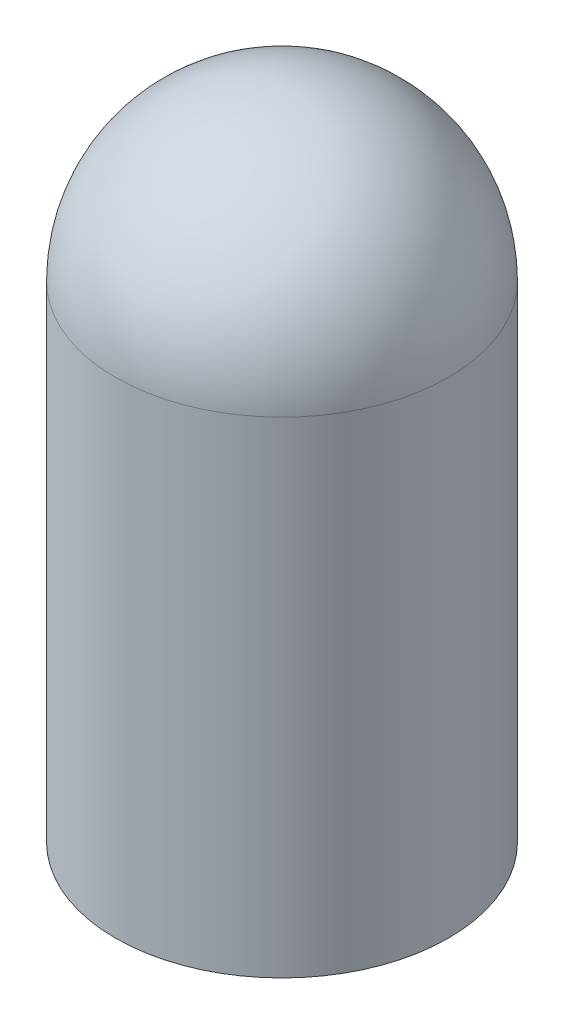
ISO-10303-21;
HEADER;
FILE_DESCRIPTION(('STEP AP214'),'2;1');
FILE_NAME('part.step','',(''),(''),'','','');
FILE_SCHEMA(('AUTOMOTIVE_DESIGN { 1 0 10303 214 1 1 1 1 }'));
ENDSEC;
DATA;
#1=APPLICATION_CONTEXT('core data for automotive mechanical design processes');
#2=APPLICATION_PROTOCOL_DEFINITION('international standard','automotive_design',2000,#1);
#3=PRODUCT_CONTEXT('',#1,'mechanical');
#4=PRODUCT('Part','Part','',(#3));
#5=PRODUCT_RELATED_PRODUCT_CATEGORY('part','',(#4));
#6=PRODUCT_DEFINITION_FORMATION('','',#4);
#7=PRODUCT_DEFINITION_CONTEXT('part definition',#1,'design');
#8=PRODUCT_DEFINITION('design','',#6,#7);
#9=PRODUCT_DEFINITION_SHAPE('','',#8);
#10=(LENGTH_UNIT() NAMED_UNIT(*) SI_UNIT(.MILLI.,.METRE.));
#11=(NAMED_UNIT(*) PLANE_ANGLE_UNIT() SI_UNIT($,.RADIAN.));
#12=(NAMED_UNIT(*) SI_UNIT($,.STERADIAN.) SOLID_ANGLE_UNIT());
#13=UNCERTAINTY_MEASURE_WITH_UNIT(LENGTH_MEASURE(1.E-05),#10,'distance_accuracy_value','');
#14=(GEOMETRIC_REPRESENTATION_CONTEXT(3) GLOBAL_UNCERTAINTY_ASSIGNED_CONTEXT((#13)) GLOBAL_UNIT_ASSIGNED_CONTEXT((#10,
#11,#12)) REPRESENTATION_CONTEXT('',''));
#15=CARTESIAN_POINT('',(0.,0.,0.));
#16=DIRECTION('',(0.,0.,1.));
#17=DIRECTION('',(1.,0.,0.));
#18=AXIS2_PLACEMENT_3D('',#15,#16,#17);
#19=CARTESIAN_POINT('',(0.,0.,0.));
#20=DIRECTION('',(0.,1.,0.));
#21=DIRECTION('',(1.,0.,0.));
#22=AXIS2_PLACEMENT_3D('',#19,#20,#21);
#23=SPHERICAL_SURFACE('',#22,12.);
#24=CARTESIAN_POINT('',(0.,0.,0.));
#25=DIRECTION('',(0.,1.,0.));
#26=DIRECTION('',(0.,0.,1.));
#27=AXIS2_PLACEMENT_3D('',#24,#25,#26);
#28=CIRCLE('',#27,12.);
#29=CARTESIAN_POINT('',(0.,0.,12.));
#30=VERTEX_POINT('',#29);
#31=EDGE_CURVE('E45',#30,#30,#28,.T.);
#32=ORIENTED_EDGE('',*,*,#31,.T.);
#33=EDGE_LOOP('',(#32));
#34=FACE_BOUND('',#33,.T.);
#35=ADVANCED_FACE('F31',(#34),#23,.T.);
#36=CARTESIAN_POINT('',(0.,0.,0.));
#37=DIRECTION('',(0.,1.,0.));
#38=DIRECTION('',(1.,0.,0.));
#39=AXIS2_PLACEMENT_3D('',#36,#37,#38);
#40=SPHERICAL_SURFACE('',#39,10.5);
#41=CARTESIAN_POINT('',(0.,0.,0.));
#42=DIRECTION('',(0.,1.,0.));
#43=DIRECTION('',(0.,0.,1.));
#44=AXIS2_PLACEMENT_3D('',#41,#42,#43);
#45=CIRCLE('',#44,10.5);
#46=CARTESIAN_POINT('',(0.,0.,10.5));
#47=VERTEX_POINT('',#46);
#48=EDGE_CURVE('E10',#47,#47,#45,.T.);
#49=ORIENTED_EDGE('',*,*,#48,.F.);
#50=EDGE_LOOP('',(#49));
#51=FACE_BOUND('',#50,.T.);
#52=ADVANCED_FACE('F65',(#51),#40,.F.);
#53=CARTESIAN_POINT('',(0.,12.,0.));
#54=DIRECTION('',(0.,1.,0.));
#55=DIRECTION('',(0.,0.,1.));
#56=AXIS2_PLACEMENT_3D('',#53,#54,#55);
#57=CYLINDRICAL_SURFACE('',#56,10.5);
#58=CARTESIAN_POINT('',(0.,-35.,0.));
#59=DIRECTION('',(0.,1.,0.));
#60=DIRECTION('',(0.,0.,1.));
#61=AXIS2_PLACEMENT_3D('',#58,#59,#60);
#62=CIRCLE('',#61,10.5);
#63=CARTESIAN_POINT('',(0.,-35.,10.5));
#64=VERTEX_POINT('',#63);
#65=EDGE_CURVE('E37',#64,#64,#62,.T.);
#66=ORIENTED_EDGE('',*,*,#65,.F.);
#67=EDGE_LOOP('',(#66));
#68=FACE_BOUND('',#67,.T.);
#69=ORIENTED_EDGE('',*,*,#48,.T.);
#70=EDGE_LOOP('',(#69));
#71=FACE_BOUND('',#70,.T.);
#72=ADVANCED_FACE('F60',(#68,#71),#57,.F.);
#73=CARTESIAN_POINT('',(10.5,-35.,0.));
#74=DIRECTION('',(0.,1.,0.));
#75=DIRECTION('',(0.,0.,1.));
#76=AXIS2_PLACEMENT_3D('',#73,#74,#75);
#77=PLANE('',#76);
#78=CARTESIAN_POINT('',(0.,-35.,0.));
#79=DIRECTION('',(0.,1.,0.));
#80=DIRECTION('',(0.,0.,1.));
#81=AXIS2_PLACEMENT_3D('',#78,#79,#80);
#82=CIRCLE('',#81,12.);
#83=CARTESIAN_POINT('',(0.,-35.,12.));
#84=VERTEX_POINT('',#83);
#85=EDGE_CURVE('E41',#84,#84,#82,.T.);
#86=ORIENTED_EDGE('',*,*,#85,.F.);
#87=EDGE_LOOP('',(#86));
#88=FACE_BOUND('',#87,.T.);
#89=ORIENTED_EDGE('',*,*,#65,.T.);
#90=EDGE_LOOP('',(#89));
#91=FACE_BOUND('',#90,.T.);
#92=ADVANCED_FACE('F55',(#88,#91),#77,.F.);
#93=CARTESIAN_POINT('',(0.,12.,0.));
#94=DIRECTION('',(0.,1.,0.));
#95=DIRECTION('',(0.,0.,1.));
#96=AXIS2_PLACEMENT_3D('',#93,#94,#95);
#97=CYLINDRICAL_SURFACE('',#96,12.);
#98=ORIENTED_EDGE('',*,*,#31,.F.);
#99=EDGE_LOOP('',(#98));
#100=FACE_BOUND('',#99,.T.);
#101=ORIENTED_EDGE('',*,*,#85,.T.);
#102=EDGE_LOOP('',(#101));
#103=FACE_BOUND('',#102,.T.);
#104=ADVANCED_FACE('F52',(#100,#103),#97,.T.);
#105=CLOSED_SHELL('',(#35,#52,#72,#92,#104));
#106=MANIFOLD_SOLID_BREP('B2',#105);
#107=ADVANCED_BREP_SHAPE_REPRESENTATION('',(#18,#106),#14);
#108=SHAPE_DEFINITION_REPRESENTATION(#9,#107);
ENDSEC;
END-ISO-10303-21;
